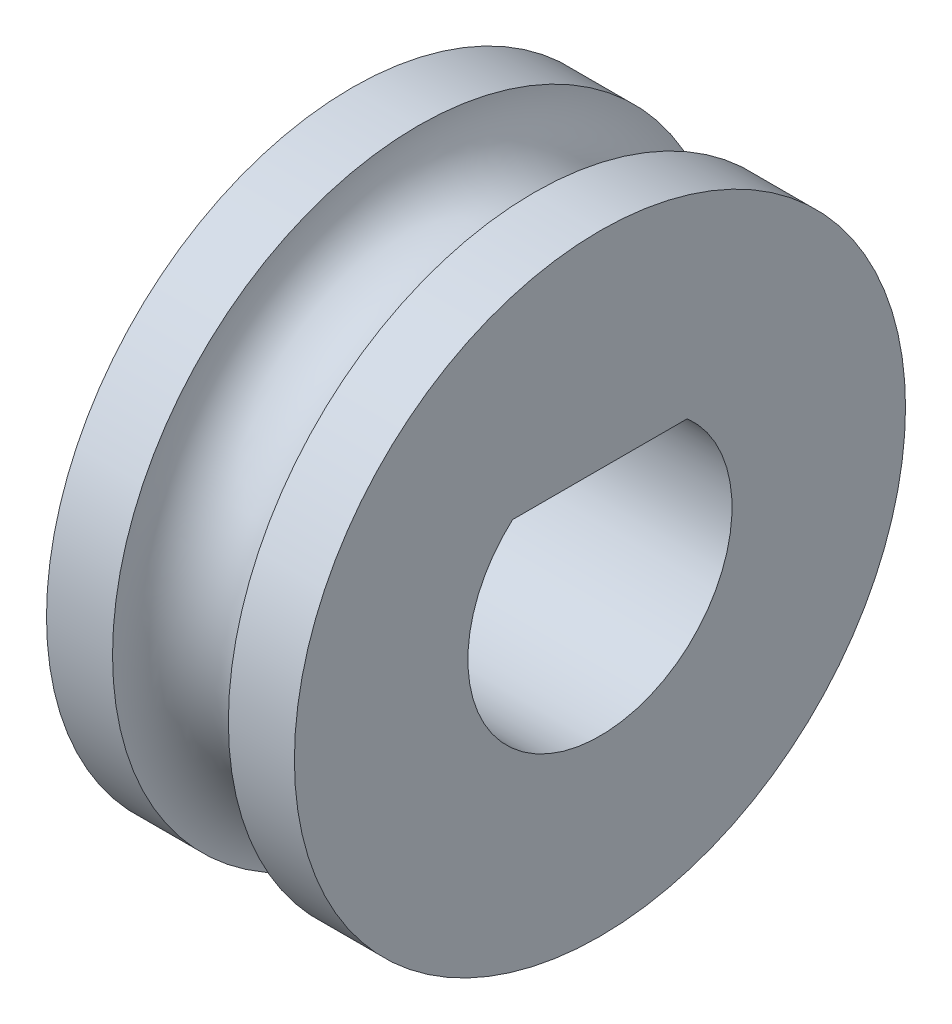
ISO-10303-21;
HEADER;
FILE_DESCRIPTION(('STEP AP214'),'2;1');
FILE_NAME('part.step','',(''),(''),'','','');
FILE_SCHEMA(('AUTOMOTIVE_DESIGN { 1 0 10303 214 1 1 1 1 }'));
ENDSEC;
DATA;
#1=APPLICATION_CONTEXT('core data for automotive mechanical design processes');
#2=APPLICATION_PROTOCOL_DEFINITION('international standard','automotive_design',2000,#1);
#3=PRODUCT_CONTEXT('',#1,'mechanical');
#4=PRODUCT('Part','Part','',(#3));
#5=PRODUCT_RELATED_PRODUCT_CATEGORY('part','',(#4));
#6=PRODUCT_DEFINITION_FORMATION('','',#4);
#7=PRODUCT_DEFINITION_CONTEXT('part definition',#1,'design');
#8=PRODUCT_DEFINITION('design','',#6,#7);
#9=PRODUCT_DEFINITION_SHAPE('','',#8);
#10=(LENGTH_UNIT() NAMED_UNIT(*) SI_UNIT(.MILLI.,.METRE.));
#11=(NAMED_UNIT(*) PLANE_ANGLE_UNIT() SI_UNIT($,.RADIAN.));
#12=(NAMED_UNIT(*) SI_UNIT($,.STERADIAN.) SOLID_ANGLE_UNIT());
#13=UNCERTAINTY_MEASURE_WITH_UNIT(LENGTH_MEASURE(1.E-05),#10,'distance_accuracy_value','');
#14=(GEOMETRIC_REPRESENTATION_CONTEXT(3) GLOBAL_UNCERTAINTY_ASSIGNED_CONTEXT((#13)) GLOBAL_UNIT_ASSIGNED_CONTEXT((#10,
#11,#12)) REPRESENTATION_CONTEXT('',''));
#15=CARTESIAN_POINT('',(0.,0.,0.));
#16=DIRECTION('',(0.,0.,1.));
#17=DIRECTION('',(1.,0.,0.));
#18=AXIS2_PLACEMENT_3D('',#15,#16,#17);
#19=CARTESIAN_POINT('',(0.,0.,0.));
#20=DIRECTION('',(1.,0.,0.));
#21=DIRECTION('',(0.,1.,0.));
#22=AXIS2_PLACEMENT_3D('',#19,#20,#21);
#23=TOROIDAL_SURFACE('',#22,9.254000034,1.753997);
#24=CARTESIAN_POINT('',(-1.753997,0.,0.));
#25=DIRECTION('',(-1.,0.,0.));
#26=DIRECTION('',(0.,-1.,0.));
#27=AXIS2_PLACEMENT_3D('',#24,#25,#26);
#28=CIRCLE('',#27,9.254000034);
#29=CARTESIAN_POINT('',(-1.753997,-9.254000034,0.));
#30=VERTEX_POINT('',#29);
#31=EDGE_CURVE('E78',#30,#30,#28,.T.);
#32=ORIENTED_EDGE('',*,*,#31,.F.);
#33=EDGE_LOOP('',(#32));
#34=FACE_BOUND('',#33,.T.);
#35=CARTESIAN_POINT('',(1.753997,0.,0.));
#36=DIRECTION('',(1.,0.,0.));
#37=DIRECTION('',(0.,1.,0.));
#38=AXIS2_PLACEMENT_3D('',#35,#36,#37);
#39=CIRCLE('',#38,9.254000034);
#40=CARTESIAN_POINT('',(1.753997,9.254000034,0.));
#41=VERTEX_POINT('',#40);
#42=EDGE_CURVE('E11',#41,#41,#39,.T.);
#43=ORIENTED_EDGE('',*,*,#42,.F.);
#44=EDGE_LOOP('',(#43));
#45=FACE_BOUND('',#44,.T.);
#46=ADVANCED_FACE('F33',(#34,#45),#23,.F.);
#47=CARTESIAN_POINT('',(1.753997,0.,0.));
#48=DIRECTION('',(-1.,0.,0.));
#49=DIRECTION('',(0.,0.,1.));
#50=AXIS2_PLACEMENT_3D('',#47,#48,#49);
#51=CYLINDRICAL_SURFACE('',#50,4.);
#52=DIRECTION('',(-1.,0.,0.));
#53=VECTOR('',#52,1.);
#54=CARTESIAN_POINT('',(1.753997,3.,-2.64575131106459));
#55=LINE('',#54,#53);
#56=CARTESIAN_POINT('',(3.753997,3.,-2.64575131106459));
#57=VERTEX_POINT('',#56);
#58=CARTESIAN_POINT('',(-3.753997,3.,-2.64575131106459));
#59=VERTEX_POINT('',#58);
#60=EDGE_CURVE('E53',#57,#59,#55,.T.);
#61=ORIENTED_EDGE('',*,*,#60,.T.);
#62=CARTESIAN_POINT('',(-3.753997,0.,0.));
#63=DIRECTION('',(-1.,0.,0.));
#64=DIRECTION('',(0.,-1.,0.));
#65=AXIS2_PLACEMENT_3D('',#62,#63,#64);
#66=CIRCLE('',#65,4.);
#67=CARTESIAN_POINT('',(-3.753997,3.,2.64575131106459));
#68=VERTEX_POINT('',#67);
#69=EDGE_CURVE('E62',#59,#68,#66,.T.);
#70=ORIENTED_EDGE('',*,*,#69,.T.);
#71=DIRECTION('',(-1.,0.,0.));
#72=VECTOR('',#71,1.);
#73=CARTESIAN_POINT('',(1.753997,3.,2.64575131106459));
#74=LINE('',#73,#72);
#75=CARTESIAN_POINT('',(3.753997,3.,2.64575131106459));
#76=VERTEX_POINT('',#75);
#77=EDGE_CURVE('E40',#76,#68,#74,.T.);
#78=ORIENTED_EDGE('',*,*,#77,.F.);
#79=CARTESIAN_POINT('',(3.753997,0.,0.));
#80=DIRECTION('',(-1.,0.,0.));
#81=DIRECTION('',(0.,-1.,0.));
#82=AXIS2_PLACEMENT_3D('',#79,#80,#81);
#83=CIRCLE('',#82,4.);
#84=EDGE_CURVE('E59',#57,#76,#83,.T.);
#85=ORIENTED_EDGE('',*,*,#84,.F.);
#86=EDGE_LOOP('',(#61,#70,#78,#85));
#87=FACE_BOUND('',#86,.T.);
#88=ADVANCED_FACE('F57',(#87),#51,.F.);
#89=CARTESIAN_POINT('',(1.753997,3.,0.));
#90=DIRECTION('',(0.,1.,0.));
#91=DIRECTION('',(0.,0.,1.));
#92=AXIS2_PLACEMENT_3D('',#89,#90,#91);
#93=PLANE('',#92);
#94=ORIENTED_EDGE('',*,*,#77,.T.);
#95=DIRECTION('',(0.,0.,-1.));
#96=VECTOR('',#95,1.);
#97=CARTESIAN_POINT('',(-3.753997,3.,2.64575131106459));
#98=LINE('',#97,#96);
#99=EDGE_CURVE('E76',#68,#59,#98,.T.);
#100=ORIENTED_EDGE('',*,*,#99,.T.);
#101=ORIENTED_EDGE('',*,*,#60,.F.);
#102=DIRECTION('',(0.,0.,-1.));
#103=VECTOR('',#102,1.);
#104=CARTESIAN_POINT('',(3.753997,3.,2.64575131106459));
#105=LINE('',#104,#103);
#106=EDGE_CURVE('E64',#76,#57,#105,.T.);
#107=ORIENTED_EDGE('',*,*,#106,.F.);
#108=EDGE_LOOP('',(#94,#100,#101,#107));
#109=FACE_BOUND('',#108,.T.);
#110=ADVANCED_FACE('F65',(#109),#93,.F.);
#111=CARTESIAN_POINT('',(-3.753997,0.,0.));
#112=DIRECTION('',(-1.,0.,0.));
#113=DIRECTION('',(0.,-1.,0.));
#114=AXIS2_PLACEMENT_3D('',#111,#112,#113);
#115=PLANE('',#114);
#116=CARTESIAN_POINT('',(-3.753997,0.,0.));
#117=DIRECTION('',(-1.,0.,0.));
#118=DIRECTION('',(0.,-1.,0.));
#119=AXIS2_PLACEMENT_3D('',#116,#117,#118);
#120=CIRCLE('',#119,9.254000034);
#121=CARTESIAN_POINT('',(-3.753997,-9.254000034,0.));
#122=VERTEX_POINT('',#121);
#123=EDGE_CURVE('E79',#122,#122,#120,.T.);
#124=ORIENTED_EDGE('',*,*,#123,.T.);
#125=EDGE_LOOP('',(#124));
#126=FACE_BOUND('',#125,.T.);
#127=ORIENTED_EDGE('',*,*,#99,.F.);
#128=ORIENTED_EDGE('',*,*,#69,.F.);
#129=EDGE_LOOP('',(#127,#128));
#130=FACE_BOUND('',#129,.T.);
#131=ADVANCED_FACE('F101',(#126,#130),#115,.T.);
#132=CARTESIAN_POINT('',(-3.753997,0.,0.));
#133=DIRECTION('',(1.,0.,0.));
#134=DIRECTION('',(0.,1.,0.));
#135=AXIS2_PLACEMENT_3D('',#132,#133,#134);
#136=CYLINDRICAL_SURFACE('',#135,9.254000034);
#137=ORIENTED_EDGE('',*,*,#123,.F.);
#138=EDGE_LOOP('',(#137));
#139=FACE_BOUND('',#138,.T.);
#140=ORIENTED_EDGE('',*,*,#31,.T.);
#141=EDGE_LOOP('',(#140));
#142=FACE_BOUND('',#141,.T.);
#143=ADVANCED_FACE('F86',(#139,#142),#136,.T.);
#144=CARTESIAN_POINT('',(3.753997,0.,0.));
#145=DIRECTION('',(-1.,0.,0.));
#146=DIRECTION('',(0.,-1.,0.));
#147=AXIS2_PLACEMENT_3D('',#144,#145,#146);
#148=CYLINDRICAL_SURFACE('',#147,9.254000034);
#149=CARTESIAN_POINT('',(3.753997,0.,0.));
#150=DIRECTION('',(-1.,0.,0.));
#151=DIRECTION('',(0.,-1.,0.));
#152=AXIS2_PLACEMENT_3D('',#149,#150,#151);
#153=CIRCLE('',#152,9.254000034);
#154=CARTESIAN_POINT('',(3.753997,-9.254000034,0.));
#155=VERTEX_POINT('',#154);
#156=EDGE_CURVE('E67',#155,#155,#153,.T.);
#157=ORIENTED_EDGE('',*,*,#156,.T.);
#158=EDGE_LOOP('',(#157));
#159=FACE_BOUND('',#158,.T.);
#160=ORIENTED_EDGE('',*,*,#42,.T.);
#161=EDGE_LOOP('',(#160));
#162=FACE_BOUND('',#161,.T.);
#163=ADVANCED_FACE('F92',(#159,#162),#148,.T.);
#164=CARTESIAN_POINT('',(3.753997,0.,0.));
#165=DIRECTION('',(1.,0.,0.));
#166=DIRECTION('',(0.,-1.,0.));
#167=AXIS2_PLACEMENT_3D('',#164,#165,#166);
#168=PLANE('',#167);
#169=ORIENTED_EDGE('',*,*,#84,.T.);
#170=ORIENTED_EDGE('',*,*,#106,.T.);
#171=EDGE_LOOP('',(#169,#170));
#172=FACE_BOUND('',#171,.T.);
#173=ORIENTED_EDGE('',*,*,#156,.F.);
#174=EDGE_LOOP('',(#173));
#175=FACE_BOUND('',#174,.T.);
#176=ADVANCED_FACE('F69',(#172,#175),#168,.T.);
#177=CLOSED_SHELL('',(#46,#88,#110,#131,#143,#163,#176));
#178=MANIFOLD_SOLID_BREP('B2',#177);
#179=ADVANCED_BREP_SHAPE_REPRESENTATION('',(#18,#178),#14);
#180=SHAPE_DEFINITION_REPRESENTATION(#9,#179);
ENDSEC;
END-ISO-10303-21;
